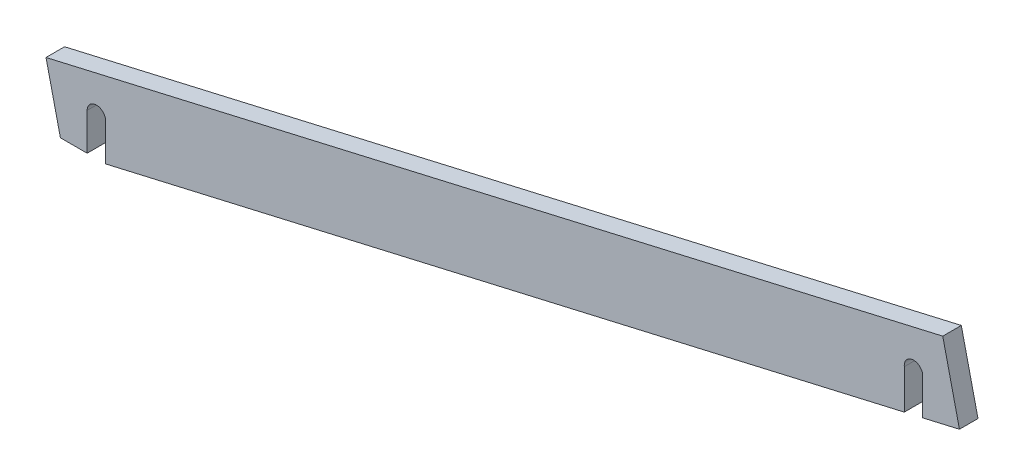
ISO-10303-21;
HEADER;
FILE_DESCRIPTION(('STEP AP214'),'2;1');
FILE_NAME('part.step','',(''),(''),'','','');
FILE_SCHEMA(('AUTOMOTIVE_DESIGN { 1 0 10303 214 1 1 1 1 }'));
ENDSEC;
DATA;
#1=APPLICATION_CONTEXT('core data for automotive mechanical design processes');
#2=APPLICATION_PROTOCOL_DEFINITION('international standard','automotive_design',2000,#1);
#3=PRODUCT_CONTEXT('',#1,'mechanical');
#4=PRODUCT('Part','Part','',(#3));
#5=PRODUCT_RELATED_PRODUCT_CATEGORY('part','',(#4));
#6=PRODUCT_DEFINITION_FORMATION('','',#4);
#7=PRODUCT_DEFINITION_CONTEXT('part definition',#1,'design');
#8=PRODUCT_DEFINITION('design','',#6,#7);
#9=PRODUCT_DEFINITION_SHAPE('','',#8);
#10=(LENGTH_UNIT() NAMED_UNIT(*) SI_UNIT(.MILLI.,.METRE.));
#11=(NAMED_UNIT(*) PLANE_ANGLE_UNIT() SI_UNIT($,.RADIAN.));
#12=(NAMED_UNIT(*) SI_UNIT($,.STERADIAN.) SOLID_ANGLE_UNIT());
#13=UNCERTAINTY_MEASURE_WITH_UNIT(LENGTH_MEASURE(1.E-05),#10,'distance_accuracy_value','');
#14=(GEOMETRIC_REPRESENTATION_CONTEXT(3) GLOBAL_UNCERTAINTY_ASSIGNED_CONTEXT((#13)) GLOBAL_UNIT_ASSIGNED_CONTEXT((#10,
#11,#12)) REPRESENTATION_CONTEXT('',''));
#15=CARTESIAN_POINT('',(0.,0.,0.));
#16=DIRECTION('',(0.,0.,1.));
#17=DIRECTION('',(1.,0.,0.));
#18=AXIS2_PLACEMENT_3D('',#15,#16,#17);
#19=CARTESIAN_POINT('',(0.,0.,1.5875));
#20=DIRECTION('',(0.,1.,0.));
#21=DIRECTION('',(-1.,0.,0.));
#22=AXIS2_PLACEMENT_3D('',#19,#20,#21);
#23=PLANE('',#22);
#24=DIRECTION('',(1.,0.,0.));
#25=VECTOR('',#24,1.);
#26=CARTESIAN_POINT('',(0.,0.,0.));
#27=LINE('',#26,#25);
#28=CARTESIAN_POINT('',(-2.286,0.,0.));
#29=VERTEX_POINT('',#28);
#30=CARTESIAN_POINT('',(0.,0.,0.));
#31=VERTEX_POINT('',#30);
#32=EDGE_CURVE('E167',#29,#31,#27,.T.);
#33=ORIENTED_EDGE('',*,*,#32,.T.);
#34=DIRECTION('',(0.,0.,-1.));
#35=VECTOR('',#34,1.);
#36=CARTESIAN_POINT('',(0.,0.,1.5875));
#37=LINE('',#36,#35);
#38=CARTESIAN_POINT('',(0.,0.,1.5875));
#39=VERTEX_POINT('',#38);
#40=EDGE_CURVE('E11',#39,#31,#37,.T.);
#41=ORIENTED_EDGE('',*,*,#40,.F.);
#42=DIRECTION('',(1.,0.,0.));
#43=VECTOR('',#42,1.);
#44=CARTESIAN_POINT('',(0.,0.,1.5875));
#45=LINE('',#44,#43);
#46=CARTESIAN_POINT('',(-2.286,0.,1.5875));
#47=VERTEX_POINT('',#46);
#48=EDGE_CURVE('E201',#47,#39,#45,.T.);
#49=ORIENTED_EDGE('',*,*,#48,.F.);
#50=DIRECTION('',(0.,0.,-1.));
#51=VECTOR('',#50,1.);
#52=CARTESIAN_POINT('',(-2.286,0.,1.5875));
#53=LINE('',#52,#51);
#54=EDGE_CURVE('E163',#47,#29,#53,.T.);
#55=ORIENTED_EDGE('',*,*,#54,.T.);
#56=EDGE_LOOP('',(#33,#41,#49,#55));
#57=FACE_BOUND('',#56,.T.);
#58=ADVANCED_FACE('F42',(#57),#23,.F.);
#59=CARTESIAN_POINT('',(0.,0.,1.5875));
#60=DIRECTION('',(-1.,0.,0.));
#61=DIRECTION('',(0.,0.,1.));
#62=AXIS2_PLACEMENT_3D('',#59,#60,#61);
#63=PLANE('',#62);
#64=DIRECTION('',(0.,1.,0.));
#65=VECTOR('',#64,1.);
#66=CARTESIAN_POINT('',(0.,0.,0.));
#67=LINE('',#66,#65);
#68=CARTESIAN_POINT('',(0.,3.175,0.));
#69=VERTEX_POINT('',#68);
#70=EDGE_CURVE('E171',#31,#69,#67,.T.);
#71=ORIENTED_EDGE('',*,*,#70,.T.);
#72=DIRECTION('',(0.,0.,-1.));
#73=VECTOR('',#72,1.);
#74=CARTESIAN_POINT('',(0.,3.175,1.5875));
#75=LINE('',#74,#73);
#76=CARTESIAN_POINT('',(0.,3.175,1.5875));
#77=VERTEX_POINT('',#76);
#78=EDGE_CURVE('E51',#77,#69,#75,.T.);
#79=ORIENTED_EDGE('',*,*,#78,.F.);
#80=DIRECTION('',(0.,1.,0.));
#81=VECTOR('',#80,1.);
#82=CARTESIAN_POINT('',(0.,0.,1.5875));
#83=LINE('',#82,#81);
#84=EDGE_CURVE('E113',#39,#77,#83,.T.);
#85=ORIENTED_EDGE('',*,*,#84,.F.);
#86=ORIENTED_EDGE('',*,*,#40,.T.);
#87=EDGE_LOOP('',(#71,#79,#85,#86));
#88=FACE_BOUND('',#87,.T.);
#89=ADVANCED_FACE('F295',(#88),#63,.F.);
#90=CARTESIAN_POINT('',(0.79375,3.175,1.5875));
#91=DIRECTION('',(0.,0.,-1.));
#92=DIRECTION('',(-1.,0.,0.));
#93=AXIS2_PLACEMENT_3D('',#90,#91,#92);
#94=CYLINDRICAL_SURFACE('',#93,0.79375);
#95=CARTESIAN_POINT('',(0.79375,3.175,0.));
#96=DIRECTION('',(0.,0.,-1.));
#97=DIRECTION('',(-1.,0.,0.));
#98=AXIS2_PLACEMENT_3D('',#95,#96,#97);
#99=CIRCLE('',#98,0.79375);
#100=CARTESIAN_POINT('',(1.5875,3.175,0.));
#101=VERTEX_POINT('',#100);
#102=EDGE_CURVE('E174',#69,#101,#99,.T.);
#103=ORIENTED_EDGE('',*,*,#102,.T.);
#104=DIRECTION('',(0.,0.,-1.));
#105=VECTOR('',#104,1.);
#106=CARTESIAN_POINT('',(1.5875,3.175,1.5875));
#107=LINE('',#106,#105);
#108=CARTESIAN_POINT('',(1.5875,3.175,1.5875));
#109=VERTEX_POINT('',#108);
#110=EDGE_CURVE('E228',#109,#101,#107,.T.);
#111=ORIENTED_EDGE('',*,*,#110,.F.);
#112=CARTESIAN_POINT('',(0.79375,3.175,1.5875));
#113=DIRECTION('',(0.,0.,-1.));
#114=DIRECTION('',(-1.,0.,0.));
#115=AXIS2_PLACEMENT_3D('',#112,#113,#114);
#116=CIRCLE('',#115,0.79375);
#117=EDGE_CURVE('E238',#77,#109,#116,.T.);
#118=ORIENTED_EDGE('',*,*,#117,.F.);
#119=ORIENTED_EDGE('',*,*,#78,.T.);
#120=EDGE_LOOP('',(#103,#111,#118,#119));
#121=FACE_BOUND('',#120,.T.);
#122=ADVANCED_FACE('F236',(#121),#94,.F.);
#123=CARTESIAN_POINT('',(1.5875,3.175,1.5875));
#124=DIRECTION('',(1.,0.,0.));
#125=DIRECTION('',(0.,1.,0.));
#126=AXIS2_PLACEMENT_3D('',#123,#124,#125);
#127=PLANE('',#126);
#128=DIRECTION('',(0.,-1.,0.));
#129=VECTOR('',#128,1.);
#130=CARTESIAN_POINT('',(1.5875,3.175,0.));
#131=LINE('',#130,#129);
#132=CARTESIAN_POINT('',(1.5875,0.,0.));
#133=VERTEX_POINT('',#132);
#134=EDGE_CURVE('E177',#101,#133,#131,.T.);
#135=ORIENTED_EDGE('',*,*,#134,.T.);
#136=DIRECTION('',(0.,0.,-1.));
#137=VECTOR('',#136,1.);
#138=CARTESIAN_POINT('',(1.5875,0.,1.5875));
#139=LINE('',#138,#137);
#140=CARTESIAN_POINT('',(1.5875,0.,1.5875));
#141=VERTEX_POINT('',#140);
#142=EDGE_CURVE('E224',#141,#133,#139,.T.);
#143=ORIENTED_EDGE('',*,*,#142,.F.);
#144=DIRECTION('',(0.,-1.,0.));
#145=VECTOR('',#144,1.);
#146=CARTESIAN_POINT('',(1.5875,3.175,1.5875));
#147=LINE('',#146,#145);
#148=EDGE_CURVE('E257',#109,#141,#147,.T.);
#149=ORIENTED_EDGE('',*,*,#148,.F.);
#150=ORIENTED_EDGE('',*,*,#110,.T.);
#151=EDGE_LOOP('',(#135,#143,#149,#150));
#152=FACE_BOUND('',#151,.T.);
#153=ADVANCED_FACE('F247',(#152),#127,.F.);
#154=CARTESIAN_POINT('',(1.5875,0.,1.5875));
#155=DIRECTION('',(-0.224951054343865,0.974370064785235,0.));
#156=DIRECTION('',(-0.974370064785235,-0.224951054343865,0.));
#157=AXIS2_PLACEMENT_3D('',#154,#155,#156);
#158=PLANE('',#157);
#159=DIRECTION('',(0.974370064785235,0.224951054343865,0.));
#160=VECTOR('',#159,1.);
#161=CARTESIAN_POINT('',(1.5875,0.,0.));
#162=LINE('',#161,#160);
#163=CARTESIAN_POINT('',(69.9135,15.7743000268452,0.));
#164=VERTEX_POINT('',#163);
#165=EDGE_CURVE('E180',#133,#164,#162,.T.);
#166=ORIENTED_EDGE('',*,*,#165,.T.);
#167=DIRECTION('',(0.,0.,-1.));
#168=VECTOR('',#167,1.);
#169=CARTESIAN_POINT('',(69.9135,15.7743000268452,1.5875));
#170=LINE('',#169,#168);
#171=CARTESIAN_POINT('',(69.9135,15.7743000268452,1.5875));
#172=VERTEX_POINT('',#171);
#173=EDGE_CURVE('E220',#172,#164,#170,.T.);
#174=ORIENTED_EDGE('',*,*,#173,.F.);
#175=DIRECTION('',(0.974370064785235,0.224951054343865,0.));
#176=VECTOR('',#175,1.);
#177=CARTESIAN_POINT('',(1.5875,0.,1.5875));
#178=LINE('',#177,#176);
#179=EDGE_CURVE('E253',#141,#172,#178,.T.);
#180=ORIENTED_EDGE('',*,*,#179,.F.);
#181=ORIENTED_EDGE('',*,*,#142,.T.);
#182=EDGE_LOOP('',(#166,#174,#180,#181));
#183=FACE_BOUND('',#182,.T.);
#184=ADVANCED_FACE('F251',(#183),#158,.F.);
#185=CARTESIAN_POINT('',(69.9135,15.7743000268452,1.5875));
#186=DIRECTION('',(-1.,0.,0.));
#187=DIRECTION('',(0.,0.,1.));
#188=AXIS2_PLACEMENT_3D('',#185,#186,#187);
#189=PLANE('',#188);
#190=DIRECTION('',(0.,1.,0.));
#191=VECTOR('',#190,1.);
#192=CARTESIAN_POINT('',(69.9135,15.7743000268452,0.));
#193=LINE('',#192,#191);
#194=CARTESIAN_POINT('',(69.9135,19.1468961461989,0.));
#195=VERTEX_POINT('',#194);
#196=EDGE_CURVE('E183',#164,#195,#193,.T.);
#197=ORIENTED_EDGE('',*,*,#196,.T.);
#198=DIRECTION('',(0.,0.,-1.));
#199=VECTOR('',#198,1.);
#200=CARTESIAN_POINT('',(69.9135,19.1468961461989,1.5875));
#201=LINE('',#200,#199);
#202=CARTESIAN_POINT('',(69.9135,19.1468961461989,1.5875));
#203=VERTEX_POINT('',#202);
#204=EDGE_CURVE('E216',#203,#195,#201,.T.);
#205=ORIENTED_EDGE('',*,*,#204,.F.);
#206=DIRECTION('',(0.,1.,0.));
#207=VECTOR('',#206,1.);
#208=CARTESIAN_POINT('',(69.9135,15.7743000268452,1.5875));
#209=LINE('',#208,#207);
#210=EDGE_CURVE('E256',#172,#203,#209,.T.);
#211=ORIENTED_EDGE('',*,*,#210,.F.);
#212=ORIENTED_EDGE('',*,*,#173,.T.);
#213=EDGE_LOOP('',(#197,#205,#211,#212));
#214=FACE_BOUND('',#213,.T.);
#215=ADVANCED_FACE('F308',(#214),#189,.F.);
#216=CARTESIAN_POINT('',(70.7028523388019,19.230334433142,1.5875));
#217=DIRECTION('',(0.,0.,-1.));
#218=DIRECTION('',(-1.,0.,0.));
#219=AXIS2_PLACEMENT_3D('',#216,#217,#218);
#220=CYLINDRICAL_SURFACE('',#219,0.793750000000001);
#221=CARTESIAN_POINT('',(70.7028523388019,19.230334433142,0.));
#222=DIRECTION('',(0.,0.,-1.));
#223=DIRECTION('',(-1.,0.,0.));
#224=AXIS2_PLACEMENT_3D('',#221,#222,#223);
#225=CIRCLE('',#224,0.793750000000001);
#226=CARTESIAN_POINT('',(71.4922046776038,19.3137727200851,0.));
#227=VERTEX_POINT('',#226);
#228=EDGE_CURVE('E186',#195,#227,#225,.T.);
#229=ORIENTED_EDGE('',*,*,#228,.T.);
#230=DIRECTION('',(0.,0.,-1.));
#231=VECTOR('',#230,1.);
#232=CARTESIAN_POINT('',(71.4922046776038,19.3137727200851,1.5875));
#233=LINE('',#232,#231);
#234=CARTESIAN_POINT('',(71.4922046776038,19.3137727200851,1.5875));
#235=VERTEX_POINT('',#234);
#236=EDGE_CURVE('E212',#235,#227,#233,.T.);
#237=ORIENTED_EDGE('',*,*,#236,.F.);
#238=CARTESIAN_POINT('',(70.7028523388019,19.230334433142,1.5875));
#239=DIRECTION('',(0.,0.,-1.));
#240=DIRECTION('',(-1.,0.,0.));
#241=AXIS2_PLACEMENT_3D('',#238,#239,#240);
#242=CIRCLE('',#241,0.793750000000001);
#243=EDGE_CURVE('E261',#203,#235,#242,.T.);
#244=ORIENTED_EDGE('',*,*,#243,.F.);
#245=ORIENTED_EDGE('',*,*,#204,.T.);
#246=EDGE_LOOP('',(#229,#237,#244,#245));
#247=FACE_BOUND('',#246,.T.);
#248=ADVANCED_FACE('F311',(#247),#220,.F.);
#249=CARTESIAN_POINT('',(71.4922046776038,19.3137727200851,1.5875));
#250=DIRECTION('',(1.,0.,0.));
#251=DIRECTION('',(0.,0.,-1.));
#252=AXIS2_PLACEMENT_3D('',#249,#250,#251);
#253=PLANE('',#252);
#254=DIRECTION('',(0.,-1.,0.));
#255=VECTOR('',#254,1.);
#256=CARTESIAN_POINT('',(71.4922046776038,19.3137727200851,0.));
#257=LINE('',#256,#255);
#258=CARTESIAN_POINT('',(71.4922046776038,16.1387727200851,0.));
#259=VERTEX_POINT('',#258);
#260=EDGE_CURVE('E189',#227,#259,#257,.T.);
#261=ORIENTED_EDGE('',*,*,#260,.T.);
#262=DIRECTION('',(0.,0.,-1.));
#263=VECTOR('',#262,1.);
#264=CARTESIAN_POINT('',(71.4922046776038,16.1387727200851,1.5875));
#265=LINE('',#264,#263);
#266=CARTESIAN_POINT('',(71.4922046776038,16.1387727200851,1.5875));
#267=VERTEX_POINT('',#266);
#268=EDGE_CURVE('E208',#267,#259,#265,.T.);
#269=ORIENTED_EDGE('',*,*,#268,.F.);
#270=DIRECTION('',(0.,-1.,0.));
#271=VECTOR('',#270,1.);
#272=CARTESIAN_POINT('',(71.4922046776038,19.3137727200851,1.5875));
#273=LINE('',#272,#271);
#274=EDGE_CURVE('E268',#235,#267,#273,.T.);
#275=ORIENTED_EDGE('',*,*,#274,.F.);
#276=ORIENTED_EDGE('',*,*,#236,.T.);
#277=EDGE_LOOP('',(#261,#269,#275,#276));
#278=FACE_BOUND('',#277,.T.);
#279=ADVANCED_FACE('F276',(#278),#253,.F.);
#280=CARTESIAN_POINT('',(71.4922046776038,16.1387727200851,1.5875));
#281=DIRECTION('',(-0.224951054343865,0.974370064785235,0.));
#282=DIRECTION('',(-0.974370064785235,-0.224951054343865,0.));
#283=AXIS2_PLACEMENT_3D('',#280,#281,#282);
#284=PLANE('',#283);
#285=DIRECTION('',(0.974370064785235,0.224951054343865,0.));
#286=VECTOR('',#285,1.);
#287=CARTESIAN_POINT('',(71.4922046776038,16.1387727200851,0.));
#288=LINE('',#287,#286);
#289=CARTESIAN_POINT('',(74.6319095320195,16.8636307004922,0.));
#290=VERTEX_POINT('',#289);
#291=EDGE_CURVE('E192',#259,#290,#288,.T.);
#292=ORIENTED_EDGE('',*,*,#291,.T.);
#293=DIRECTION('',(0.,0.,-1.));
#294=VECTOR('',#293,1.);
#295=CARTESIAN_POINT('',(74.6319095320195,16.8636307004922,1.5875));
#296=LINE('',#295,#294);
#297=CARTESIAN_POINT('',(74.6319095320195,16.8636307004922,1.5875));
#298=VERTEX_POINT('',#297);
#299=EDGE_CURVE('E156',#298,#290,#296,.T.);
#300=ORIENTED_EDGE('',*,*,#299,.F.);
#301=DIRECTION('',(0.974370064785235,0.224951054343865,0.));
#302=VECTOR('',#301,1.);
#303=CARTESIAN_POINT('',(71.4922046776038,16.1387727200851,1.5875));
#304=LINE('',#303,#302);
#305=EDGE_CURVE('E144',#267,#298,#304,.T.);
#306=ORIENTED_EDGE('',*,*,#305,.F.);
#307=ORIENTED_EDGE('',*,*,#268,.T.);
#308=EDGE_LOOP('',(#292,#300,#306,#307));
#309=FACE_BOUND('',#308,.T.);
#310=ADVANCED_FACE('F280',(#309),#284,.F.);
#311=CARTESIAN_POINT('',(74.6319095320195,16.8636307004922,1.5875));
#312=DIRECTION('',(-0.974370064785235,-0.224951054343864,0.));
#313=DIRECTION('',(0.224951054343864,-0.974370064785235,0.));
#314=AXIS2_PLACEMENT_3D('',#311,#312,#313);
#315=PLANE('',#314);
#316=DIRECTION('',(-0.224951054343864,0.974370064785235,0.));
#317=VECTOR('',#316,1.);
#318=CARTESIAN_POINT('',(74.6319095320195,16.8636307004922,0.));
#319=LINE('',#318,#317);
#320=CARTESIAN_POINT('',(73.203470336936,23.0508806118785,0.));
#321=VERTEX_POINT('',#320);
#322=EDGE_CURVE('E154',#290,#321,#319,.T.);
#323=ORIENTED_EDGE('',*,*,#322,.T.);
#324=DIRECTION('',(0.,0.,-1.));
#325=VECTOR('',#324,1.);
#326=CARTESIAN_POINT('',(73.203470336936,23.0508806118785,1.5875));
#327=LINE('',#326,#325);
#328=CARTESIAN_POINT('',(73.203470336936,23.0508806118785,1.5875));
#329=VERTEX_POINT('',#328);
#330=EDGE_CURVE('E151',#329,#321,#327,.T.);
#331=ORIENTED_EDGE('',*,*,#330,.F.);
#332=DIRECTION('',(-0.224951054343864,0.974370064785235,0.));
#333=VECTOR('',#332,1.);
#334=CARTESIAN_POINT('',(74.6319095320195,16.8636307004922,1.5875));
#335=LINE('',#334,#333);
#336=EDGE_CURVE('E138',#298,#329,#335,.T.);
#337=ORIENTED_EDGE('',*,*,#336,.F.);
#338=ORIENTED_EDGE('',*,*,#299,.T.);
#339=EDGE_LOOP('',(#323,#331,#337,#338));
#340=FACE_BOUND('',#339,.T.);
#341=ADVANCED_FACE('F152',(#340),#315,.F.);
#342=CARTESIAN_POINT('',(1.5875,6.51703108448804,1.5875));
#343=DIRECTION('',(0.224951054343866,-0.974370064785235,0.));
#344=DIRECTION('',(0.974370064785235,0.224951054343866,0.));
#345=AXIS2_PLACEMENT_3D('',#342,#343,#344);
#346=PLANE('',#345);
#347=DIRECTION('',(-0.974370064785235,-0.224951054343866,0.));
#348=VECTOR('',#347,1.);
#349=CARTESIAN_POINT('',(1.5875,6.51703108448804,0.));
#350=LINE('',#349,#348);
#351=CARTESIAN_POINT('',(-3.51842856425346,5.3382345928425,0.));
#352=VERTEX_POINT('',#351);
#353=EDGE_CURVE('E99',#321,#352,#350,.T.);
#354=ORIENTED_EDGE('',*,*,#353,.T.);
#355=DIRECTION('',(0.,0.,-1.));
#356=VECTOR('',#355,1.);
#357=CARTESIAN_POINT('',(-3.51842856425346,5.3382345928425,1.5875));
#358=LINE('',#357,#356);
#359=CARTESIAN_POINT('',(-3.51842856425346,5.3382345928425,1.5875));
#360=VERTEX_POINT('',#359);
#361=EDGE_CURVE('E157',#360,#352,#358,.T.);
#362=ORIENTED_EDGE('',*,*,#361,.F.);
#363=DIRECTION('',(-0.974370064785235,-0.224951054343865,0.));
#364=VECTOR('',#363,1.);
#365=CARTESIAN_POINT('',(1.5875,6.51703108448804,1.5875));
#366=LINE('',#365,#364);
#367=EDGE_CURVE('E142',#329,#360,#366,.T.);
#368=ORIENTED_EDGE('',*,*,#367,.F.);
#369=ORIENTED_EDGE('',*,*,#330,.T.);
#370=EDGE_LOOP('',(#354,#362,#368,#369));
#371=FACE_BOUND('',#370,.T.);
#372=ADVANCED_FACE('F159',(#371),#346,.F.);
#373=CARTESIAN_POINT('',(-2.286,0.,1.5875));
#374=DIRECTION('',(0.974370064785235,0.224951054343866,0.));
#375=DIRECTION('',(-0.224951054343866,0.974370064785235,0.));
#376=AXIS2_PLACEMENT_3D('',#373,#374,#375);
#377=PLANE('',#376);
#378=DIRECTION('',(0.224951054343866,-0.974370064785235,0.));
#379=VECTOR('',#378,1.);
#380=CARTESIAN_POINT('',(-2.286,0.,0.));
#381=LINE('',#380,#379);
#382=EDGE_CURVE('E105',#352,#29,#381,.T.);
#383=ORIENTED_EDGE('',*,*,#382,.T.);
#384=ORIENTED_EDGE('',*,*,#54,.F.);
#385=DIRECTION('',(0.224951054343866,-0.974370064785235,0.));
#386=VECTOR('',#385,1.);
#387=CARTESIAN_POINT('',(-2.286,0.,1.5875));
#388=LINE('',#387,#386);
#389=EDGE_CURVE('E59',#360,#47,#388,.T.);
#390=ORIENTED_EDGE('',*,*,#389,.F.);
#391=ORIENTED_EDGE('',*,*,#361,.T.);
#392=EDGE_LOOP('',(#383,#384,#390,#391));
#393=FACE_BOUND('',#392,.T.);
#394=ADVANCED_FACE('F284',(#393),#377,.F.);
#395=CARTESIAN_POINT('',(70.7028523388019,19.230334433142,1.5875));
#396=DIRECTION('',(0.,0.,-1.));
#397=DIRECTION('',(-1.,0.,0.));
#398=AXIS2_PLACEMENT_3D('',#395,#396,#397);
#399=PLANE('',#398);
#400=ORIENTED_EDGE('',*,*,#48,.T.);
#401=ORIENTED_EDGE('',*,*,#84,.T.);
#402=ORIENTED_EDGE('',*,*,#117,.T.);
#403=ORIENTED_EDGE('',*,*,#148,.T.);
#404=ORIENTED_EDGE('',*,*,#179,.T.);
#405=ORIENTED_EDGE('',*,*,#210,.T.);
#406=ORIENTED_EDGE('',*,*,#243,.T.);
#407=ORIENTED_EDGE('',*,*,#274,.T.);
#408=ORIENTED_EDGE('',*,*,#305,.T.);
#409=ORIENTED_EDGE('',*,*,#336,.T.);
#410=ORIENTED_EDGE('',*,*,#367,.T.);
#411=ORIENTED_EDGE('',*,*,#389,.T.);
#412=EDGE_LOOP('',(#400,#401,#402,#403,#404,#405,#406,#407,#408,#409,#410,#411));
#413=FACE_BOUND('',#412,.T.);
#414=ADVANCED_FACE('F140',(#413),#399,.F.);
#415=CARTESIAN_POINT('',(70.7028523388019,19.230334433142,0.));
#416=DIRECTION('',(0.,0.,-1.));
#417=DIRECTION('',(-1.,0.,0.));
#418=AXIS2_PLACEMENT_3D('',#415,#416,#417);
#419=PLANE('',#418);
#420=ORIENTED_EDGE('',*,*,#32,.F.);
#421=ORIENTED_EDGE('',*,*,#382,.F.);
#422=ORIENTED_EDGE('',*,*,#353,.F.);
#423=ORIENTED_EDGE('',*,*,#322,.F.);
#424=ORIENTED_EDGE('',*,*,#291,.F.);
#425=ORIENTED_EDGE('',*,*,#260,.F.);
#426=ORIENTED_EDGE('',*,*,#228,.F.);
#427=ORIENTED_EDGE('',*,*,#196,.F.);
#428=ORIENTED_EDGE('',*,*,#165,.F.);
#429=ORIENTED_EDGE('',*,*,#134,.F.);
#430=ORIENTED_EDGE('',*,*,#102,.F.);
#431=ORIENTED_EDGE('',*,*,#70,.F.);
#432=EDGE_LOOP('',(#420,#421,#422,#423,#424,#425,#426,#427,#428,#429,#430,#431));
#433=FACE_BOUND('',#432,.T.);
#434=ADVANCED_FACE('F242',(#433),#419,.T.);
#435=CLOSED_SHELL('',(#58,#89,#122,#153,#184,#215,#248,#279,#310,#341,#372,#394,#414,#434));
#436=MANIFOLD_SOLID_BREP('B2',#435);
#437=ADVANCED_BREP_SHAPE_REPRESENTATION('',(#18,#436),#14);
#438=SHAPE_DEFINITION_REPRESENTATION(#9,#437);
ENDSEC;
END-ISO-10303-21;
